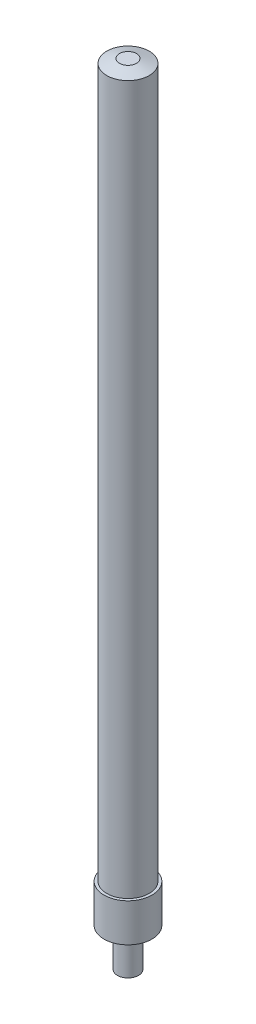
ISO-10303-21;
HEADER;
FILE_DESCRIPTION(('STEP AP214'),'2;1');
FILE_NAME('part.step','',(''),(''),'','','');
FILE_SCHEMA(('AUTOMOTIVE_DESIGN { 1 0 10303 214 1 1 1 1 }'));
ENDSEC;
DATA;
#1=APPLICATION_CONTEXT('core data for automotive mechanical design processes');
#2=APPLICATION_PROTOCOL_DEFINITION('international standard','automotive_design',2000,#1);
#3=PRODUCT_CONTEXT('',#1,'mechanical');
#4=PRODUCT('Part','Part','',(#3));
#5=PRODUCT_RELATED_PRODUCT_CATEGORY('part','',(#4));
#6=PRODUCT_DEFINITION_FORMATION('','',#4);
#7=PRODUCT_DEFINITION_CONTEXT('part definition',#1,'design');
#8=PRODUCT_DEFINITION('design','',#6,#7);
#9=PRODUCT_DEFINITION_SHAPE('','',#8);
#10=(LENGTH_UNIT() NAMED_UNIT(*) SI_UNIT(.MILLI.,.METRE.));
#11=(NAMED_UNIT(*) PLANE_ANGLE_UNIT() SI_UNIT($,.RADIAN.));
#12=(NAMED_UNIT(*) SI_UNIT($,.STERADIAN.) SOLID_ANGLE_UNIT());
#13=UNCERTAINTY_MEASURE_WITH_UNIT(LENGTH_MEASURE(1.E-05),#10,'distance_accuracy_value','');
#14=(GEOMETRIC_REPRESENTATION_CONTEXT(3) GLOBAL_UNCERTAINTY_ASSIGNED_CONTEXT((#13)) GLOBAL_UNIT_ASSIGNED_CONTEXT((#10,
#11,#12)) REPRESENTATION_CONTEXT('',''));
#15=CARTESIAN_POINT('',(0.,0.,0.));
#16=DIRECTION('',(0.,0.,1.));
#17=DIRECTION('',(1.,0.,0.));
#18=AXIS2_PLACEMENT_3D('',#15,#16,#17);
#19=CARTESIAN_POINT('',(0.,561.975,0.));
#20=DIRECTION('',(0.,-1.,0.));
#21=DIRECTION('',(0.,0.,-1.));
#22=AXIS2_PLACEMENT_3D('',#19,#20,#21);
#23=PLANE('',#22);
#24=CARTESIAN_POINT('',(0.,561.975,0.));
#25=DIRECTION('',(0.,1.,0.));
#26=DIRECTION('',(0.,0.,1.));
#27=AXIS2_PLACEMENT_3D('',#24,#25,#26);
#28=CIRCLE('',#27,6.35);
#29=CARTESIAN_POINT('',(0.,561.975,6.35));
#30=VERTEX_POINT('',#29);
#31=EDGE_CURVE('E10',#30,#30,#28,.T.);
#32=ORIENTED_EDGE('',*,*,#31,.T.);
#33=EDGE_LOOP('',(#32));
#34=FACE_BOUND('',#33,.T.);
#35=ADVANCED_FACE('F31',(#34),#23,.F.);
#36=CARTESIAN_POINT('',(0.,558.8,0.));
#37=DIRECTION('',(0.,-1.,0.));
#38=DIRECTION('',(0.,0.,-1.));
#39=AXIS2_PLACEMENT_3D('',#36,#37,#38);
#40=CONICAL_SURFACE('',#39,15.8749999999999,1.24904577239825);
#41=ORIENTED_EDGE('',*,*,#31,.F.);
#42=EDGE_LOOP('',(#41));
#43=FACE_BOUND('',#42,.T.);
#44=CARTESIAN_POINT('',(0.,558.8,0.));
#45=DIRECTION('',(0.,1.,0.));
#46=DIRECTION('',(0.,0.,1.));
#47=AXIS2_PLACEMENT_3D('',#44,#45,#46);
#48=CIRCLE('',#47,15.8749999999999);
#49=CARTESIAN_POINT('',(0.,558.8,15.8749999999999));
#50=VERTEX_POINT('',#49);
#51=EDGE_CURVE('E37',#50,#50,#48,.T.);
#52=ORIENTED_EDGE('',*,*,#51,.T.);
#53=EDGE_LOOP('',(#52));
#54=FACE_BOUND('',#53,.T.);
#55=ADVANCED_FACE('F72',(#43,#54),#40,.T.);
#56=CARTESIAN_POINT('',(0.,561.975,0.));
#57=DIRECTION('',(0.,1.,0.));
#58=DIRECTION('',(0.,0.,1.));
#59=AXIS2_PLACEMENT_3D('',#56,#57,#58);
#60=CYLINDRICAL_SURFACE('',#59,15.875);
#61=ORIENTED_EDGE('',*,*,#51,.F.);
#62=EDGE_LOOP('',(#61));
#63=FACE_BOUND('',#62,.T.);
#64=CARTESIAN_POINT('',(0.,28.575,0.));
#65=DIRECTION('',(0.,1.,0.));
#66=DIRECTION('',(0.,0.,1.));
#67=AXIS2_PLACEMENT_3D('',#64,#65,#66);
#68=CIRCLE('',#67,15.875);
#69=CARTESIAN_POINT('',(0.,28.575,15.875));
#70=VERTEX_POINT('',#69);
#71=EDGE_CURVE('E41',#70,#70,#68,.T.);
#72=ORIENTED_EDGE('',*,*,#71,.T.);
#73=EDGE_LOOP('',(#72));
#74=FACE_BOUND('',#73,.T.);
#75=ADVANCED_FACE('F76',(#63,#74),#60,.T.);
#76=CARTESIAN_POINT('',(15.875,28.575,0.));
#77=DIRECTION('',(0.,-1.,0.));
#78=DIRECTION('',(0.,0.,-1.));
#79=AXIS2_PLACEMENT_3D('',#76,#77,#78);
#80=PLANE('',#79);
#81=ORIENTED_EDGE('',*,*,#71,.F.);
#82=EDGE_LOOP('',(#81));
#83=FACE_BOUND('',#82,.T.);
#84=CARTESIAN_POINT('',(0.,28.575,0.));
#85=DIRECTION('',(0.,1.,0.));
#86=DIRECTION('',(0.,0.,1.));
#87=AXIS2_PLACEMENT_3D('',#84,#85,#86);
#88=CIRCLE('',#87,17.9451);
#89=CARTESIAN_POINT('',(0.,28.575,17.9451));
#90=VERTEX_POINT('',#89);
#91=EDGE_CURVE('E45',#90,#90,#88,.T.);
#92=ORIENTED_EDGE('',*,*,#91,.T.);
#93=EDGE_LOOP('',(#92));
#94=FACE_BOUND('',#93,.T.);
#95=ADVANCED_FACE('F81',(#83,#94),#80,.F.);
#96=CARTESIAN_POINT('',(0.,561.975,0.));
#97=DIRECTION('',(0.,1.,0.));
#98=DIRECTION('',(0.,0.,1.));
#99=AXIS2_PLACEMENT_3D('',#96,#97,#98);
#100=CYLINDRICAL_SURFACE('',#99,17.9451);
#101=ORIENTED_EDGE('',*,*,#91,.F.);
#102=EDGE_LOOP('',(#101));
#103=FACE_BOUND('',#102,.T.);
#104=CARTESIAN_POINT('',(0.,0.,0.));
#105=DIRECTION('',(0.,1.,0.));
#106=DIRECTION('',(0.,0.,1.));
#107=AXIS2_PLACEMENT_3D('',#104,#105,#106);
#108=CIRCLE('',#107,17.9451);
#109=CARTESIAN_POINT('',(0.,0.,17.9451));
#110=VERTEX_POINT('',#109);
#111=EDGE_CURVE('E50',#110,#110,#108,.T.);
#112=ORIENTED_EDGE('',*,*,#111,.T.);
#113=EDGE_LOOP('',(#112));
#114=FACE_BOUND('',#113,.T.);
#115=ADVANCED_FACE('F87',(#103,#114),#100,.T.);
#116=CARTESIAN_POINT('',(17.9451,0.,0.));
#117=DIRECTION('',(0.,1.,0.));
#118=DIRECTION('',(0.,0.,1.));
#119=AXIS2_PLACEMENT_3D('',#116,#117,#118);
#120=PLANE('',#119);
#121=ORIENTED_EDGE('',*,*,#111,.F.);
#122=EDGE_LOOP('',(#121));
#123=FACE_BOUND('',#122,.T.);
#124=CARTESIAN_POINT('',(0.,0.,0.));
#125=DIRECTION('',(0.,1.,0.));
#126=DIRECTION('',(0.,0.,1.));
#127=AXIS2_PLACEMENT_3D('',#124,#125,#126);
#128=CIRCLE('',#127,7.8867);
#129=CARTESIAN_POINT('',(0.,0.,7.8867));
#130=VERTEX_POINT('',#129);
#131=EDGE_CURVE('E53',#130,#130,#128,.T.);
#132=ORIENTED_EDGE('',*,*,#131,.T.);
#133=EDGE_LOOP('',(#132));
#134=FACE_BOUND('',#133,.T.);
#135=ADVANCED_FACE('F68',(#123,#134),#120,.F.);
#136=CARTESIAN_POINT('',(0.,561.975,0.));
#137=DIRECTION('',(0.,1.,0.));
#138=DIRECTION('',(0.,0.,1.));
#139=AXIS2_PLACEMENT_3D('',#136,#137,#138);
#140=CYLINDRICAL_SURFACE('',#139,7.8867);
#141=ORIENTED_EDGE('',*,*,#131,.F.);
#142=EDGE_LOOP('',(#141));
#143=FACE_BOUND('',#142,.T.);
#144=CARTESIAN_POINT('',(0.,-28.575,0.));
#145=DIRECTION('',(0.,1.,0.));
#146=DIRECTION('',(0.,0.,1.));
#147=AXIS2_PLACEMENT_3D('',#144,#145,#146);
#148=CIRCLE('',#147,7.88670000000001);
#149=CARTESIAN_POINT('',(0.,-28.575,7.88670000000001));
#150=VERTEX_POINT('',#149);
#151=EDGE_CURVE('E56',#150,#150,#148,.T.);
#152=ORIENTED_EDGE('',*,*,#151,.T.);
#153=EDGE_LOOP('',(#152));
#154=FACE_BOUND('',#153,.T.);
#155=ADVANCED_FACE('F60',(#143,#154),#140,.T.);
#156=CARTESIAN_POINT('',(7.88670000000001,-28.575,0.));
#157=DIRECTION('',(0.,1.,0.));
#158=DIRECTION('',(0.,0.,1.));
#159=AXIS2_PLACEMENT_3D('',#156,#157,#158);
#160=PLANE('',#159);
#161=ORIENTED_EDGE('',*,*,#151,.F.);
#162=EDGE_LOOP('',(#161));
#163=FACE_BOUND('',#162,.T.);
#164=ADVANCED_FACE('F62',(#163),#160,.F.);
#165=CLOSED_SHELL('',(#35,#55,#75,#95,#115,#135,#155,#164));
#166=MANIFOLD_SOLID_BREP('B2',#165);
#167=ADVANCED_BREP_SHAPE_REPRESENTATION('',(#18,#166),#14);
#168=SHAPE_DEFINITION_REPRESENTATION(#9,#167);
ENDSEC;
END-ISO-10303-21;
